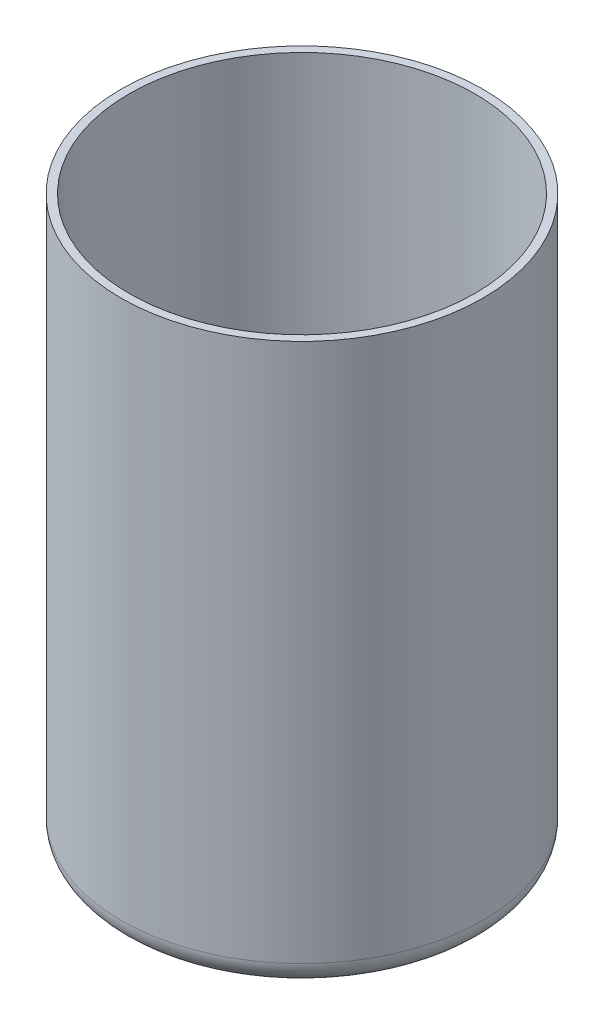
ISO-10303-21;
HEADER;
FILE_DESCRIPTION(('STEP AP214'),'2;1');
FILE_NAME('part.step','',(''),(''),'','','');
FILE_SCHEMA(('AUTOMOTIVE_DESIGN { 1 0 10303 214 1 1 1 1 }'));
ENDSEC;
DATA;
#1=APPLICATION_CONTEXT('core data for automotive mechanical design processes');
#2=APPLICATION_PROTOCOL_DEFINITION('international standard','automotive_design',2000,#1);
#3=PRODUCT_CONTEXT('',#1,'mechanical');
#4=PRODUCT('Part','Part','',(#3));
#5=PRODUCT_RELATED_PRODUCT_CATEGORY('part','',(#4));
#6=PRODUCT_DEFINITION_FORMATION('','',#4);
#7=PRODUCT_DEFINITION_CONTEXT('part definition',#1,'design');
#8=PRODUCT_DEFINITION('design','',#6,#7);
#9=PRODUCT_DEFINITION_SHAPE('','',#8);
#10=(LENGTH_UNIT() NAMED_UNIT(*) SI_UNIT(.MILLI.,.METRE.));
#11=(NAMED_UNIT(*) PLANE_ANGLE_UNIT() SI_UNIT($,.RADIAN.));
#12=(NAMED_UNIT(*) SI_UNIT($,.STERADIAN.) SOLID_ANGLE_UNIT());
#13=UNCERTAINTY_MEASURE_WITH_UNIT(LENGTH_MEASURE(1.E-05),#10,'distance_accuracy_value','');
#14=(GEOMETRIC_REPRESENTATION_CONTEXT(3) GLOBAL_UNCERTAINTY_ASSIGNED_CONTEXT((#13)) GLOBAL_UNIT_ASSIGNED_CONTEXT((#10,
#11,#12)) REPRESENTATION_CONTEXT('',''));
#15=CARTESIAN_POINT('',(0.,0.,0.));
#16=DIRECTION('',(0.,0.,1.));
#17=DIRECTION('',(1.,0.,0.));
#18=AXIS2_PLACEMENT_3D('',#15,#16,#17);
#19=CARTESIAN_POINT('',(0.,70.,0.));
#20=DIRECTION('',(0.,1.,0.));
#21=DIRECTION('',(0.,0.,1.));
#22=AXIS2_PLACEMENT_3D('',#19,#20,#21);
#23=PLANE('',#22);
#24=CARTESIAN_POINT('',(0.,70.,0.));
#25=DIRECTION('',(0.,1.,0.));
#26=DIRECTION('',(0.,0.,1.));
#27=AXIS2_PLACEMENT_3D('',#24,#25,#26);
#28=CIRCLE('',#27,22.5);
#29=CARTESIAN_POINT('',(0.,70.,22.5));
#30=VERTEX_POINT('',#29);
#31=EDGE_CURVE('E60',#30,#30,#28,.T.);
#32=ORIENTED_EDGE('',*,*,#31,.T.);
#33=EDGE_LOOP('',(#32));
#34=FACE_BOUND('',#33,.T.);
#35=CARTESIAN_POINT('',(0.,70.,0.));
#36=DIRECTION('',(0.,1.,0.));
#37=DIRECTION('',(1.,0.,0.));
#38=AXIS2_PLACEMENT_3D('',#35,#36,#37);
#39=CIRCLE('',#38,21.5);
#40=CARTESIAN_POINT('',(21.5,70.,0.));
#41=VERTEX_POINT('',#40);
#42=EDGE_CURVE('E65',#41,#41,#39,.T.);
#43=ORIENTED_EDGE('',*,*,#42,.F.);
#44=EDGE_LOOP('',(#43));
#45=FACE_BOUND('',#44,.T.);
#46=ADVANCED_FACE('F45',(#34,#45),#23,.T.);
#47=CARTESIAN_POINT('',(0.,0.,0.));
#48=DIRECTION('',(0.,1.,0.));
#49=DIRECTION('',(0.,0.,1.));
#50=AXIS2_PLACEMENT_3D('',#47,#48,#49);
#51=PLANE('',#50);
#52=CARTESIAN_POINT('',(0.,0.,0.));
#53=DIRECTION('',(0.,-1.,0.));
#54=DIRECTION('',(0.,0.,-1.));
#55=AXIS2_PLACEMENT_3D('',#52,#53,#54);
#56=CIRCLE('',#55,1.5);
#57=CARTESIAN_POINT('',(0.,0.,-1.5));
#58=VERTEX_POINT('',#57);
#59=EDGE_CURVE('E69',#58,#58,#56,.T.);
#60=ORIENTED_EDGE('',*,*,#59,.F.);
#61=EDGE_LOOP('',(#60));
#62=FACE_BOUND('',#61,.T.);
#63=CARTESIAN_POINT('',(0.,0.,0.));
#64=DIRECTION('',(0.,1.,0.));
#65=DIRECTION('',(0.,0.,1.));
#66=AXIS2_PLACEMENT_3D('',#63,#64,#65);
#67=CIRCLE('',#66,19.5);
#68=CARTESIAN_POINT('',(0.,0.,19.5));
#69=VERTEX_POINT('',#68);
#70=EDGE_CURVE('E11',#69,#69,#67,.F.);
#71=ORIENTED_EDGE('',*,*,#70,.T.);
#72=EDGE_LOOP('',(#71));
#73=FACE_BOUND('',#72,.T.);
#74=ADVANCED_FACE('F84',(#62,#73),#51,.F.);
#75=CARTESIAN_POINT('',(0.,70.,0.));
#76=DIRECTION('',(0.,-1.,0.));
#77=DIRECTION('',(0.,0.,-1.));
#78=AXIS2_PLACEMENT_3D('',#75,#76,#77);
#79=CYLINDRICAL_SURFACE('',#78,22.5);
#80=CARTESIAN_POINT('',(0.,3.,0.));
#81=DIRECTION('',(0.,1.,0.));
#82=DIRECTION('',(0.,0.,1.));
#83=AXIS2_PLACEMENT_3D('',#80,#81,#82);
#84=CIRCLE('',#83,22.5);
#85=CARTESIAN_POINT('',(0.,3.,22.5));
#86=VERTEX_POINT('',#85);
#87=EDGE_CURVE('E52',#86,#86,#84,.T.);
#88=ORIENTED_EDGE('',*,*,#87,.T.);
#89=EDGE_LOOP('',(#88));
#90=FACE_BOUND('',#89,.T.);
#91=ORIENTED_EDGE('',*,*,#31,.F.);
#92=EDGE_LOOP('',(#91));
#93=FACE_BOUND('',#92,.T.);
#94=ADVANCED_FACE('F86',(#90,#93),#79,.T.);
#95=CARTESIAN_POINT('',(0.,70.,0.));
#96=DIRECTION('',(0.,-1.,0.));
#97=DIRECTION('',(0.,0.,-1.));
#98=AXIS2_PLACEMENT_3D('',#95,#96,#97);
#99=CYLINDRICAL_SURFACE('',#98,21.5);
#100=CARTESIAN_POINT('',(0.,1.,0.));
#101=DIRECTION('',(0.,1.,0.));
#102=DIRECTION('',(0.,0.,1.));
#103=AXIS2_PLACEMENT_3D('',#100,#101,#102);
#104=CIRCLE('',#103,21.5);
#105=CARTESIAN_POINT('',(0.,1.,21.5));
#106=VERTEX_POINT('',#105);
#107=EDGE_CURVE('E56',#106,#106,#104,.T.);
#108=ORIENTED_EDGE('',*,*,#107,.F.);
#109=EDGE_LOOP('',(#108));
#110=FACE_BOUND('',#109,.T.);
#111=ORIENTED_EDGE('',*,*,#42,.T.);
#112=EDGE_LOOP('',(#111));
#113=FACE_BOUND('',#112,.T.);
#114=ADVANCED_FACE('F93',(#110,#113),#99,.F.);
#115=CARTESIAN_POINT('',(0.,1.,0.));
#116=DIRECTION('',(0.,1.,0.));
#117=DIRECTION('',(0.,0.,1.));
#118=AXIS2_PLACEMENT_3D('',#115,#116,#117);
#119=PLANE('',#118);
#120=CARTESIAN_POINT('',(0.,1.,0.));
#121=DIRECTION('',(0.,-1.,0.));
#122=DIRECTION('',(0.,0.,-1.));
#123=AXIS2_PLACEMENT_3D('',#120,#121,#122);
#124=CIRCLE('',#123,1.5);
#125=CARTESIAN_POINT('',(0.,1.,-1.5));
#126=VERTEX_POINT('',#125);
#127=EDGE_CURVE('E68',#126,#126,#124,.T.);
#128=ORIENTED_EDGE('',*,*,#127,.T.);
#129=EDGE_LOOP('',(#128));
#130=FACE_BOUND('',#129,.T.);
#131=ORIENTED_EDGE('',*,*,#107,.T.);
#132=EDGE_LOOP('',(#131));
#133=FACE_BOUND('',#132,.T.);
#134=ADVANCED_FACE('F75',(#130,#133),#119,.T.);
#135=CARTESIAN_POINT('',(0.,3.,0.));
#136=DIRECTION('',(0.,1.,0.));
#137=DIRECTION('',(0.,0.,1.));
#138=AXIS2_PLACEMENT_3D('',#135,#136,#137);
#139=TOROIDAL_SURFACE('',#138,19.5,3.);
#140=ORIENTED_EDGE('',*,*,#70,.F.);
#141=EDGE_LOOP('',(#140));
#142=FACE_BOUND('',#141,.T.);
#143=ORIENTED_EDGE('',*,*,#87,.F.);
#144=EDGE_LOOP('',(#143));
#145=FACE_BOUND('',#144,.T.);
#146=ADVANCED_FACE('F47',(#142,#145),#139,.T.);
#147=CARTESIAN_POINT('',(0.,1.,0.));
#148=DIRECTION('',(0.,-1.,0.));
#149=DIRECTION('',(0.,0.,-1.));
#150=AXIS2_PLACEMENT_3D('',#147,#148,#149);
#151=CYLINDRICAL_SURFACE('',#150,1.5);
#152=ORIENTED_EDGE('',*,*,#127,.F.);
#153=EDGE_LOOP('',(#152));
#154=FACE_BOUND('',#153,.T.);
#155=ORIENTED_EDGE('',*,*,#59,.T.);
#156=EDGE_LOOP('',(#155));
#157=FACE_BOUND('',#156,.T.);
#158=ADVANCED_FACE('F78',(#154,#157),#151,.F.);
#159=CLOSED_SHELL('',(#46,#74,#94,#114,#134,#146,#158));
#160=MANIFOLD_SOLID_BREP('B2',#159);
#161=ADVANCED_BREP_SHAPE_REPRESENTATION('',(#18,#160),#14);
#162=SHAPE_DEFINITION_REPRESENTATION(#9,#161);
ENDSEC;
END-ISO-10303-21;
